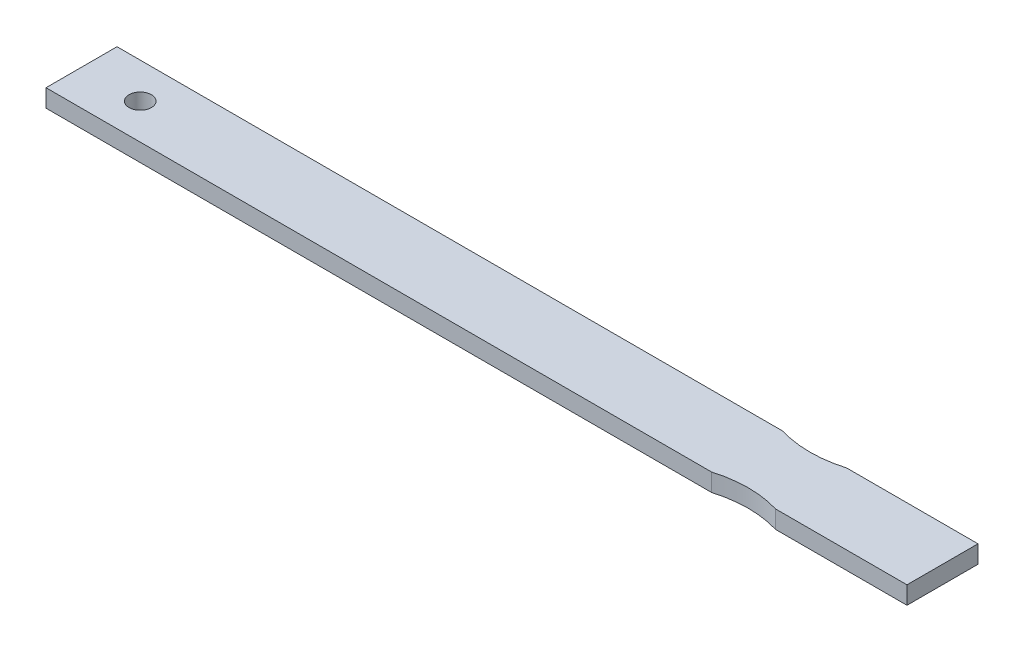
ISO-10303-21;
HEADER;
FILE_DESCRIPTION(('STEP AP214'),'2;1');
FILE_NAME('part.step','',(''),(''),'','','');
FILE_SCHEMA(('AUTOMOTIVE_DESIGN { 1 0 10303 214 1 1 1 1 }'));
ENDSEC;
DATA;
#1=APPLICATION_CONTEXT('core data for automotive mechanical design processes');
#2=APPLICATION_PROTOCOL_DEFINITION('international standard','automotive_design',2000,#1);
#3=PRODUCT_CONTEXT('',#1,'mechanical');
#4=PRODUCT('Part','Part','',(#3));
#5=PRODUCT_RELATED_PRODUCT_CATEGORY('part','',(#4));
#6=PRODUCT_DEFINITION_FORMATION('','',#4);
#7=PRODUCT_DEFINITION_CONTEXT('part definition',#1,'design');
#8=PRODUCT_DEFINITION('design','',#6,#7);
#9=PRODUCT_DEFINITION_SHAPE('','',#8);
#10=(LENGTH_UNIT() NAMED_UNIT(*) SI_UNIT(.MILLI.,.METRE.));
#11=(NAMED_UNIT(*) PLANE_ANGLE_UNIT() SI_UNIT($,.RADIAN.));
#12=(NAMED_UNIT(*) SI_UNIT($,.STERADIAN.) SOLID_ANGLE_UNIT());
#13=UNCERTAINTY_MEASURE_WITH_UNIT(LENGTH_MEASURE(1.E-05),#10,'distance_accuracy_value','');
#14=(GEOMETRIC_REPRESENTATION_CONTEXT(3) GLOBAL_UNCERTAINTY_ASSIGNED_CONTEXT((#13)) GLOBAL_UNIT_ASSIGNED_CONTEXT((#10,
#11,#12)) REPRESENTATION_CONTEXT('',''));
#15=CARTESIAN_POINT('',(0.,0.,0.));
#16=DIRECTION('',(0.,0.,1.));
#17=DIRECTION('',(1.,0.,0.));
#18=AXIS2_PLACEMENT_3D('',#15,#16,#17);
#19=CARTESIAN_POINT('',(95.53,6.35,51.0321679533));
#20=DIRECTION('',(0.,-1.,0.));
#21=DIRECTION('',(0.,0.,-1.));
#22=AXIS2_PLACEMENT_3D('',#19,#20,#21);
#23=PLANE('',#22);
#24=DIRECTION('',(-1.,0.,0.));
#25=VECTOR('',#24,1.);
#26=CARTESIAN_POINT('',(84.1,6.35,-12.7));
#27=LINE('',#26,#25);
#28=CARTESIAN_POINT('',(84.1,6.35,-12.7));
#29=VERTEX_POINT('',#28);
#30=CARTESIAN_POINT('',(-153.95,6.35,-12.7));
#31=VERTEX_POINT('',#30);
#32=EDGE_CURVE('E172',#29,#31,#27,.T.);
#33=ORIENTED_EDGE('',*,*,#32,.T.);
#34=DIRECTION('',(0.,0.,1.));
#35=VECTOR('',#34,1.);
#36=CARTESIAN_POINT('',(-153.95,6.35,12.7));
#37=LINE('',#36,#35);
#38=CARTESIAN_POINT('',(-153.95,6.35,12.7));
#39=VERTEX_POINT('',#38);
#40=EDGE_CURVE('E108',#31,#39,#37,.T.);
#41=ORIENTED_EDGE('',*,*,#40,.T.);
#42=DIRECTION('',(1.,0.,0.));
#43=VECTOR('',#42,1.);
#44=CARTESIAN_POINT('',(84.1,6.35,12.7));
#45=LINE('',#44,#43);
#46=CARTESIAN_POINT('',(84.1,6.35,12.7));
#47=VERTEX_POINT('',#46);
#48=EDGE_CURVE('E193',#39,#47,#45,.T.);
#49=ORIENTED_EDGE('',*,*,#48,.T.);
#50=CARTESIAN_POINT('',(95.53,6.35,51.0321679533));
#51=DIRECTION('',(0.,-1.,0.));
#52=DIRECTION('',(0.,0.,-1.));
#53=AXIS2_PLACEMENT_3D('',#50,#51,#52);
#54=CIRCLE('',#53,40.);
#55=CARTESIAN_POINT('',(106.96,6.35,12.7));
#56=VERTEX_POINT('',#55);
#57=EDGE_CURVE('E207',#47,#56,#54,.T.);
#58=ORIENTED_EDGE('',*,*,#57,.T.);
#59=DIRECTION('',(1.,0.,0.));
#60=VECTOR('',#59,1.);
#61=CARTESIAN_POINT('',(153.95,6.35,12.7));
#62=LINE('',#61,#60);
#63=CARTESIAN_POINT('',(153.95,6.35,12.7));
#64=VERTEX_POINT('',#63);
#65=EDGE_CURVE('E127',#56,#64,#62,.T.);
#66=ORIENTED_EDGE('',*,*,#65,.T.);
#67=DIRECTION('',(0.,0.,-1.));
#68=VECTOR('',#67,1.);
#69=CARTESIAN_POINT('',(153.95,6.35,12.7));
#70=LINE('',#69,#68);
#71=CARTESIAN_POINT('',(153.95,6.35,-12.7));
#72=VERTEX_POINT('',#71);
#73=EDGE_CURVE('E121',#64,#72,#70,.T.);
#74=ORIENTED_EDGE('',*,*,#73,.T.);
#75=DIRECTION('',(-1.,0.,0.));
#76=VECTOR('',#75,1.);
#77=CARTESIAN_POINT('',(153.95,6.35,-12.7));
#78=LINE('',#77,#76);
#79=CARTESIAN_POINT('',(106.96,6.35,-12.7));
#80=VERTEX_POINT('',#79);
#81=EDGE_CURVE('E125',#72,#80,#78,.T.);
#82=ORIENTED_EDGE('',*,*,#81,.T.);
#83=CARTESIAN_POINT('',(95.53,6.35,-51.0321679533));
#84=DIRECTION('',(0.,-1.,0.));
#85=DIRECTION('',(0.,0.,1.));
#86=AXIS2_PLACEMENT_3D('',#83,#84,#85);
#87=CIRCLE('',#86,40.);
#88=EDGE_CURVE('E65',#80,#29,#87,.T.);
#89=ORIENTED_EDGE('',*,*,#88,.T.);
#90=EDGE_LOOP('',(#33,#41,#49,#58,#66,#74,#82,#89));
#91=FACE_BOUND('',#90,.T.);
#92=CARTESIAN_POINT('',(-132.95,6.35,0.));
#93=DIRECTION('',(0.,1.,0.));
#94=DIRECTION('',(0.,0.,1.));
#95=AXIS2_PLACEMENT_3D('',#92,#93,#94);
#96=CIRCLE('',#95,3.99999999999999);
#97=CARTESIAN_POINT('',(-132.95,6.35,3.99999999999999));
#98=VERTEX_POINT('',#97);
#99=EDGE_CURVE('E154',#98,#98,#96,.T.);
#100=ORIENTED_EDGE('',*,*,#99,.F.);
#101=EDGE_LOOP('',(#100));
#102=FACE_BOUND('',#101,.T.);
#103=ADVANCED_FACE('F47',(#91,#102),#23,.F.);
#104=CARTESIAN_POINT('',(95.53,0.,51.0321679533));
#105=DIRECTION('',(0.,-1.,0.));
#106=DIRECTION('',(0.,0.,-1.));
#107=AXIS2_PLACEMENT_3D('',#104,#105,#106);
#108=PLANE('',#107);
#109=DIRECTION('',(-1.,0.,0.));
#110=VECTOR('',#109,1.);
#111=CARTESIAN_POINT('',(84.1,0.,-12.7));
#112=LINE('',#111,#110);
#113=CARTESIAN_POINT('',(84.1,0.,-12.7));
#114=VERTEX_POINT('',#113);
#115=CARTESIAN_POINT('',(-153.95,0.,-12.7));
#116=VERTEX_POINT('',#115);
#117=EDGE_CURVE('E149',#114,#116,#112,.T.);
#118=ORIENTED_EDGE('',*,*,#117,.F.);
#119=CARTESIAN_POINT('',(95.53,0.,-51.0321679533));
#120=DIRECTION('',(0.,-1.,0.));
#121=DIRECTION('',(0.,0.,1.));
#122=AXIS2_PLACEMENT_3D('',#119,#120,#121);
#123=CIRCLE('',#122,40.);
#124=CARTESIAN_POINT('',(106.96,0.,-12.7));
#125=VERTEX_POINT('',#124);
#126=EDGE_CURVE('E100',#125,#114,#123,.T.);
#127=ORIENTED_EDGE('',*,*,#126,.F.);
#128=DIRECTION('',(-1.,0.,0.));
#129=VECTOR('',#128,1.);
#130=CARTESIAN_POINT('',(153.95,0.,-12.7));
#131=LINE('',#130,#129);
#132=CARTESIAN_POINT('',(153.95,0.,-12.7));
#133=VERTEX_POINT('',#132);
#134=EDGE_CURVE('E94',#133,#125,#131,.T.);
#135=ORIENTED_EDGE('',*,*,#134,.F.);
#136=DIRECTION('',(0.,0.,-1.));
#137=VECTOR('',#136,1.);
#138=CARTESIAN_POINT('',(153.95,0.,12.7));
#139=LINE('',#138,#137);
#140=CARTESIAN_POINT('',(153.95,0.,12.7));
#141=VERTEX_POINT('',#140);
#142=EDGE_CURVE('E136',#141,#133,#139,.T.);
#143=ORIENTED_EDGE('',*,*,#142,.F.);
#144=DIRECTION('',(1.,0.,0.));
#145=VECTOR('',#144,1.);
#146=CARTESIAN_POINT('',(153.95,0.,12.7));
#147=LINE('',#146,#145);
#148=CARTESIAN_POINT('',(106.96,0.,12.7));
#149=VERTEX_POINT('',#148);
#150=EDGE_CURVE('E163',#149,#141,#147,.T.);
#151=ORIENTED_EDGE('',*,*,#150,.F.);
#152=CARTESIAN_POINT('',(95.53,0.,51.0321679533));
#153=DIRECTION('',(0.,-1.,0.));
#154=DIRECTION('',(0.,0.,-1.));
#155=AXIS2_PLACEMENT_3D('',#152,#153,#154);
#156=CIRCLE('',#155,40.);
#157=CARTESIAN_POINT('',(84.1,0.,12.7));
#158=VERTEX_POINT('',#157);
#159=EDGE_CURVE('E160',#158,#149,#156,.T.);
#160=ORIENTED_EDGE('',*,*,#159,.F.);
#161=DIRECTION('',(1.,0.,0.));
#162=VECTOR('',#161,1.);
#163=CARTESIAN_POINT('',(84.1,0.,12.7));
#164=LINE('',#163,#162);
#165=CARTESIAN_POINT('',(-153.95,0.,12.7));
#166=VERTEX_POINT('',#165);
#167=EDGE_CURVE('E157',#166,#158,#164,.T.);
#168=ORIENTED_EDGE('',*,*,#167,.F.);
#169=DIRECTION('',(0.,0.,1.));
#170=VECTOR('',#169,1.);
#171=CARTESIAN_POINT('',(-153.95,0.,12.7));
#172=LINE('',#171,#170);
#173=EDGE_CURVE('E153',#116,#166,#172,.T.);
#174=ORIENTED_EDGE('',*,*,#173,.F.);
#175=EDGE_LOOP('',(#118,#127,#135,#143,#151,#160,#168,#174));
#176=FACE_BOUND('',#175,.T.);
#177=CARTESIAN_POINT('',(-132.95,0.,0.));
#178=DIRECTION('',(0.,1.,0.));
#179=DIRECTION('',(0.,0.,1.));
#180=AXIS2_PLACEMENT_3D('',#177,#178,#179);
#181=CIRCLE('',#180,3.99999999999999);
#182=CARTESIAN_POINT('',(-132.95,0.,3.99999999999999));
#183=VERTEX_POINT('',#182);
#184=EDGE_CURVE('E217',#183,#183,#181,.T.);
#185=ORIENTED_EDGE('',*,*,#184,.T.);
#186=EDGE_LOOP('',(#185));
#187=FACE_BOUND('',#186,.T.);
#188=ADVANCED_FACE('F197',(#176,#187),#108,.T.);
#189=CARTESIAN_POINT('',(84.1,6.35,-12.7));
#190=DIRECTION('',(0.,0.,1.));
#191=DIRECTION('',(1.,0.,0.));
#192=AXIS2_PLACEMENT_3D('',#189,#190,#191);
#193=PLANE('',#192);
#194=ORIENTED_EDGE('',*,*,#117,.T.);
#195=DIRECTION('',(0.,-1.,0.));
#196=VECTOR('',#195,1.);
#197=CARTESIAN_POINT('',(-153.95,6.35,-12.7));
#198=LINE('',#197,#196);
#199=EDGE_CURVE('E11',#31,#116,#198,.T.);
#200=ORIENTED_EDGE('',*,*,#199,.F.);
#201=ORIENTED_EDGE('',*,*,#32,.F.);
#202=DIRECTION('',(0.,-1.,0.));
#203=VECTOR('',#202,1.);
#204=CARTESIAN_POINT('',(84.1,6.35,-12.7));
#205=LINE('',#204,#203);
#206=EDGE_CURVE('E145',#29,#114,#205,.T.);
#207=ORIENTED_EDGE('',*,*,#206,.T.);
#208=EDGE_LOOP('',(#194,#200,#201,#207));
#209=FACE_BOUND('',#208,.T.);
#210=ADVANCED_FACE('F49',(#209),#193,.F.);
#211=CARTESIAN_POINT('',(-153.95,6.35,12.7));
#212=DIRECTION('',(1.,0.,0.));
#213=DIRECTION('',(0.,0.,-1.));
#214=AXIS2_PLACEMENT_3D('',#211,#212,#213);
#215=PLANE('',#214);
#216=ORIENTED_EDGE('',*,*,#173,.T.);
#217=DIRECTION('',(0.,-1.,0.));
#218=VECTOR('',#217,1.);
#219=CARTESIAN_POINT('',(-153.95,6.35,12.7));
#220=LINE('',#219,#218);
#221=EDGE_CURVE('E57',#39,#166,#220,.T.);
#222=ORIENTED_EDGE('',*,*,#221,.F.);
#223=ORIENTED_EDGE('',*,*,#40,.F.);
#224=ORIENTED_EDGE('',*,*,#199,.T.);
#225=EDGE_LOOP('',(#216,#222,#223,#224));
#226=FACE_BOUND('',#225,.T.);
#227=ADVANCED_FACE('F247',(#226),#215,.F.);
#228=CARTESIAN_POINT('',(84.1,6.35,12.7));
#229=DIRECTION('',(0.,0.,-1.));
#230=DIRECTION('',(-1.,0.,0.));
#231=AXIS2_PLACEMENT_3D('',#228,#229,#230);
#232=PLANE('',#231);
#233=ORIENTED_EDGE('',*,*,#167,.T.);
#234=DIRECTION('',(0.,-1.,0.));
#235=VECTOR('',#234,1.);
#236=CARTESIAN_POINT('',(84.1,6.35,12.7));
#237=LINE('',#236,#235);
#238=EDGE_CURVE('E183',#47,#158,#237,.T.);
#239=ORIENTED_EDGE('',*,*,#238,.F.);
#240=ORIENTED_EDGE('',*,*,#48,.F.);
#241=ORIENTED_EDGE('',*,*,#221,.T.);
#242=EDGE_LOOP('',(#233,#239,#240,#241));
#243=FACE_BOUND('',#242,.T.);
#244=ADVANCED_FACE('F191',(#243),#232,.F.);
#245=CARTESIAN_POINT('',(95.53,6.35,51.0321679533));
#246=DIRECTION('',(0.,-1.,0.));
#247=DIRECTION('',(0.,0.,-1.));
#248=AXIS2_PLACEMENT_3D('',#245,#246,#247);
#249=CYLINDRICAL_SURFACE('',#248,40.);
#250=ORIENTED_EDGE('',*,*,#159,.T.);
#251=DIRECTION('',(0.,-1.,0.));
#252=VECTOR('',#251,1.);
#253=CARTESIAN_POINT('',(106.96,6.35,12.7));
#254=LINE('',#253,#252);
#255=EDGE_CURVE('E179',#56,#149,#254,.T.);
#256=ORIENTED_EDGE('',*,*,#255,.F.);
#257=ORIENTED_EDGE('',*,*,#57,.F.);
#258=ORIENTED_EDGE('',*,*,#238,.T.);
#259=EDGE_LOOP('',(#250,#256,#257,#258));
#260=FACE_BOUND('',#259,.T.);
#261=ADVANCED_FACE('F202',(#260),#249,.F.);
#262=CARTESIAN_POINT('',(153.95,6.35,12.7));
#263=DIRECTION('',(0.,0.,-1.));
#264=DIRECTION('',(-1.,0.,0.));
#265=AXIS2_PLACEMENT_3D('',#262,#263,#264);
#266=PLANE('',#265);
#267=ORIENTED_EDGE('',*,*,#150,.T.);
#268=DIRECTION('',(0.,-1.,0.));
#269=VECTOR('',#268,1.);
#270=CARTESIAN_POINT('',(153.95,6.35,12.7));
#271=LINE('',#270,#269);
#272=EDGE_CURVE('E138',#64,#141,#271,.T.);
#273=ORIENTED_EDGE('',*,*,#272,.F.);
#274=ORIENTED_EDGE('',*,*,#65,.F.);
#275=ORIENTED_EDGE('',*,*,#255,.T.);
#276=EDGE_LOOP('',(#267,#273,#274,#275));
#277=FACE_BOUND('',#276,.T.);
#278=ADVANCED_FACE('F205',(#277),#266,.F.);
#279=CARTESIAN_POINT('',(153.95,6.35,12.7));
#280=DIRECTION('',(-1.,0.,0.));
#281=DIRECTION('',(0.,0.,1.));
#282=AXIS2_PLACEMENT_3D('',#279,#280,#281);
#283=PLANE('',#282);
#284=ORIENTED_EDGE('',*,*,#142,.T.);
#285=DIRECTION('',(0.,-1.,0.));
#286=VECTOR('',#285,1.);
#287=CARTESIAN_POINT('',(153.95,6.35,-12.7));
#288=LINE('',#287,#286);
#289=EDGE_CURVE('E133',#72,#133,#288,.T.);
#290=ORIENTED_EDGE('',*,*,#289,.F.);
#291=ORIENTED_EDGE('',*,*,#73,.F.);
#292=ORIENTED_EDGE('',*,*,#272,.T.);
#293=EDGE_LOOP('',(#284,#290,#291,#292));
#294=FACE_BOUND('',#293,.T.);
#295=ADVANCED_FACE('F134',(#294),#283,.F.);
#296=CARTESIAN_POINT('',(153.95,6.35,-12.7));
#297=DIRECTION('',(0.,0.,1.));
#298=DIRECTION('',(1.,0.,0.));
#299=AXIS2_PLACEMENT_3D('',#296,#297,#298);
#300=PLANE('',#299);
#301=ORIENTED_EDGE('',*,*,#134,.T.);
#302=DIRECTION('',(0.,-1.,0.));
#303=VECTOR('',#302,1.);
#304=CARTESIAN_POINT('',(106.96,6.35,-12.7));
#305=LINE('',#304,#303);
#306=EDGE_CURVE('E139',#80,#125,#305,.T.);
#307=ORIENTED_EDGE('',*,*,#306,.F.);
#308=ORIENTED_EDGE('',*,*,#81,.F.);
#309=ORIENTED_EDGE('',*,*,#289,.T.);
#310=EDGE_LOOP('',(#301,#307,#308,#309));
#311=FACE_BOUND('',#310,.T.);
#312=ADVANCED_FACE('F141',(#311),#300,.F.);
#313=CARTESIAN_POINT('',(95.53,6.35,-51.0321679533));
#314=DIRECTION('',(0.,-1.,0.));
#315=DIRECTION('',(0.,0.,-1.));
#316=AXIS2_PLACEMENT_3D('',#313,#314,#315);
#317=CYLINDRICAL_SURFACE('',#316,40.);
#318=ORIENTED_EDGE('',*,*,#126,.T.);
#319=ORIENTED_EDGE('',*,*,#206,.F.);
#320=ORIENTED_EDGE('',*,*,#88,.F.);
#321=ORIENTED_EDGE('',*,*,#306,.T.);
#322=EDGE_LOOP('',(#318,#319,#320,#321));
#323=FACE_BOUND('',#322,.T.);
#324=ADVANCED_FACE('F235',(#323),#317,.F.);
#325=CARTESIAN_POINT('',(-132.95,6.35,0.));
#326=DIRECTION('',(0.,-1.,0.));
#327=DIRECTION('',(0.,0.,-1.));
#328=AXIS2_PLACEMENT_3D('',#325,#326,#327);
#329=CYLINDRICAL_SURFACE('',#328,3.99999999999999);
#330=ORIENTED_EDGE('',*,*,#99,.T.);
#331=EDGE_LOOP('',(#330));
#332=FACE_BOUND('',#331,.T.);
#333=ORIENTED_EDGE('',*,*,#184,.F.);
#334=EDGE_LOOP('',(#333));
#335=FACE_BOUND('',#334,.T.);
#336=ADVANCED_FACE('F225',(#332,#335),#329,.F.);
#337=CLOSED_SHELL('',(#103,#188,#210,#227,#244,#261,#278,#295,#312,#324,#336));
#338=MANIFOLD_SOLID_BREP('B2',#337);
#339=ADVANCED_BREP_SHAPE_REPRESENTATION('',(#18,#338),#14);
#340=SHAPE_DEFINITION_REPRESENTATION(#9,#339);
ENDSEC;
END-ISO-10303-21;
